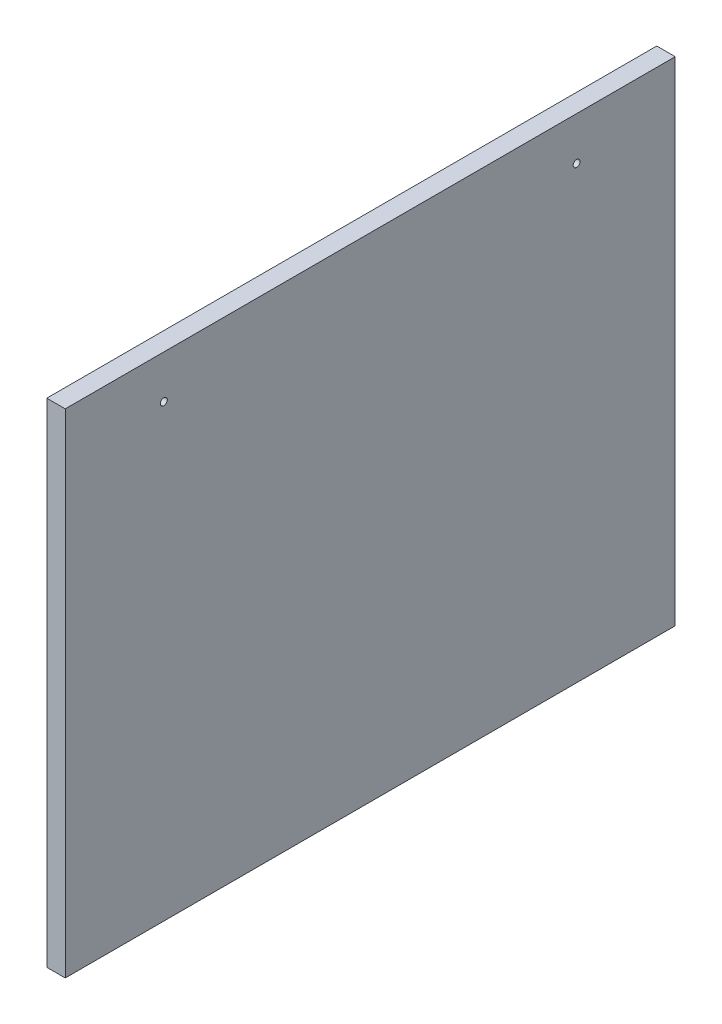
ISO-10303-21;
HEADER;
FILE_DESCRIPTION(('STEP AP214'),'2;1');
FILE_NAME('part.step','',(''),(''),'','','');
FILE_SCHEMA(('AUTOMOTIVE_DESIGN { 1 0 10303 214 1 1 1 1 }'));
ENDSEC;
DATA;
#1=APPLICATION_CONTEXT('core data for automotive mechanical design processes');
#2=APPLICATION_PROTOCOL_DEFINITION('international standard','automotive_design',2000,#1);
#3=PRODUCT_CONTEXT('',#1,'mechanical');
#4=PRODUCT('Part','Part','',(#3));
#5=PRODUCT_RELATED_PRODUCT_CATEGORY('part','',(#4));
#6=PRODUCT_DEFINITION_FORMATION('','',#4);
#7=PRODUCT_DEFINITION_CONTEXT('part definition',#1,'design');
#8=PRODUCT_DEFINITION('design','',#6,#7);
#9=PRODUCT_DEFINITION_SHAPE('','',#8);
#10=(LENGTH_UNIT() NAMED_UNIT(*) SI_UNIT(.MILLI.,.METRE.));
#11=(NAMED_UNIT(*) PLANE_ANGLE_UNIT() SI_UNIT($,.RADIAN.));
#12=(NAMED_UNIT(*) SI_UNIT($,.STERADIAN.) SOLID_ANGLE_UNIT());
#13=UNCERTAINTY_MEASURE_WITH_UNIT(LENGTH_MEASURE(1.E-05),#10,'distance_accuracy_value','');
#14=(GEOMETRIC_REPRESENTATION_CONTEXT(3) GLOBAL_UNCERTAINTY_ASSIGNED_CONTEXT((#13)) GLOBAL_UNIT_ASSIGNED_CONTEXT((#10,
#11,#12)) REPRESENTATION_CONTEXT('',''));
#15=CARTESIAN_POINT('',(0.,0.,0.));
#16=DIRECTION('',(0.,0.,1.));
#17=DIRECTION('',(1.,0.,0.));
#18=AXIS2_PLACEMENT_3D('',#15,#16,#17);
#19=CARTESIAN_POINT('',(19.05,0.,0.));
#20=DIRECTION('',(-1.,0.,0.));
#21=DIRECTION('',(0.,0.,1.));
#22=AXIS2_PLACEMENT_3D('',#19,#20,#21);
#23=PLANE('',#22);
#24=DIRECTION('',(0.,-1.,0.));
#25=VECTOR('',#24,1.);
#26=CARTESIAN_POINT('',(19.05,0.,0.));
#27=LINE('',#26,#25);
#28=CARTESIAN_POINT('',(19.05,508.,0.));
#29=VERTEX_POINT('',#28);
#30=CARTESIAN_POINT('',(19.05,0.,0.));
#31=VERTEX_POINT('',#30);
#32=EDGE_CURVE('E84',#29,#31,#27,.T.);
#33=ORIENTED_EDGE('',*,*,#32,.T.);
#34=DIRECTION('',(0.,0.,-1.));
#35=VECTOR('',#34,1.);
#36=CARTESIAN_POINT('',(19.05,0.,0.));
#37=LINE('',#36,#35);
#38=CARTESIAN_POINT('',(19.05,0.,-628.65));
#39=VERTEX_POINT('',#38);
#40=EDGE_CURVE('E79',#31,#39,#37,.T.);
#41=ORIENTED_EDGE('',*,*,#40,.T.);
#42=DIRECTION('',(0.,1.,0.));
#43=VECTOR('',#42,1.);
#44=CARTESIAN_POINT('',(19.05,0.,-628.65));
#45=LINE('',#44,#43);
#46=CARTESIAN_POINT('',(19.05,508.,-628.65));
#47=VERTEX_POINT('',#46);
#48=EDGE_CURVE('E82',#39,#47,#45,.T.);
#49=ORIENTED_EDGE('',*,*,#48,.T.);
#50=DIRECTION('',(0.,0.,1.));
#51=VECTOR('',#50,1.);
#52=CARTESIAN_POINT('',(19.05,508.,0.));
#53=LINE('',#52,#51);
#54=EDGE_CURVE('E49',#47,#29,#53,.T.);
#55=ORIENTED_EDGE('',*,*,#54,.T.);
#56=EDGE_LOOP('',(#33,#41,#49,#55));
#57=FACE_BOUND('',#56,.T.);
#58=CARTESIAN_POINT('',(19.05,463.55,-101.6));
#59=DIRECTION('',(1.,0.,0.));
#60=DIRECTION('',(0.,0.,-1.));
#61=AXIS2_PLACEMENT_3D('',#58,#59,#60);
#62=CIRCLE('',#61,3.571875);
#63=CARTESIAN_POINT('',(19.05,463.55,-98.0281249999999));
#64=VERTEX_POINT('',#63);
#65=EDGE_CURVE('E99',#64,#64,#62,.T.);
#66=ORIENTED_EDGE('',*,*,#65,.F.);
#67=EDGE_LOOP('',(#66));
#68=FACE_BOUND('',#67,.T.);
#69=CARTESIAN_POINT('',(19.05,463.55,-527.05));
#70=DIRECTION('',(1.,0.,0.));
#71=DIRECTION('',(0.,0.,-1.));
#72=AXIS2_PLACEMENT_3D('',#69,#70,#71);
#73=CIRCLE('',#72,3.57187499999998);
#74=CARTESIAN_POINT('',(19.05,463.55,-523.478125));
#75=VERTEX_POINT('',#74);
#76=EDGE_CURVE('E114',#75,#75,#73,.T.);
#77=ORIENTED_EDGE('',*,*,#76,.F.);
#78=EDGE_LOOP('',(#77));
#79=FACE_BOUND('',#78,.T.);
#80=ADVANCED_FACE('F32',(#57,#68,#79),#23,.F.);
#81=CARTESIAN_POINT('',(0.,0.,0.));
#82=DIRECTION('',(-1.,0.,0.));
#83=DIRECTION('',(0.,0.,1.));
#84=AXIS2_PLACEMENT_3D('',#81,#82,#83);
#85=PLANE('',#84);
#86=CARTESIAN_POINT('',(0.,463.55,-101.6));
#87=DIRECTION('',(1.,0.,0.));
#88=DIRECTION('',(0.,0.,-1.));
#89=AXIS2_PLACEMENT_3D('',#86,#87,#88);
#90=CIRCLE('',#89,3.571875);
#91=CARTESIAN_POINT('',(0.,463.55,-98.0281249999999));
#92=VERTEX_POINT('',#91);
#93=EDGE_CURVE('E111',#92,#92,#90,.T.);
#94=ORIENTED_EDGE('',*,*,#93,.T.);
#95=EDGE_LOOP('',(#94));
#96=FACE_BOUND('',#95,.T.);
#97=DIRECTION('',(0.,-1.,0.));
#98=VECTOR('',#97,1.);
#99=CARTESIAN_POINT('',(0.,0.,0.));
#100=LINE('',#99,#98);
#101=CARTESIAN_POINT('',(0.,508.,0.));
#102=VERTEX_POINT('',#101);
#103=CARTESIAN_POINT('',(0.,0.,0.));
#104=VERTEX_POINT('',#103);
#105=EDGE_CURVE('E96',#102,#104,#100,.T.);
#106=ORIENTED_EDGE('',*,*,#105,.F.);
#107=DIRECTION('',(0.,0.,1.));
#108=VECTOR('',#107,1.);
#109=CARTESIAN_POINT('',(0.,508.,0.));
#110=LINE('',#109,#108);
#111=CARTESIAN_POINT('',(0.,508.,-628.65));
#112=VERTEX_POINT('',#111);
#113=EDGE_CURVE('E72',#112,#102,#110,.T.);
#114=ORIENTED_EDGE('',*,*,#113,.F.);
#115=DIRECTION('',(0.,1.,0.));
#116=VECTOR('',#115,1.);
#117=CARTESIAN_POINT('',(0.,0.,-628.65));
#118=LINE('',#117,#116);
#119=CARTESIAN_POINT('',(0.,0.,-628.65));
#120=VERTEX_POINT('',#119);
#121=EDGE_CURVE('E66',#120,#112,#118,.T.);
#122=ORIENTED_EDGE('',*,*,#121,.F.);
#123=DIRECTION('',(0.,0.,-1.));
#124=VECTOR('',#123,1.);
#125=CARTESIAN_POINT('',(0.,0.,0.));
#126=LINE('',#125,#124);
#127=EDGE_CURVE('E88',#104,#120,#126,.T.);
#128=ORIENTED_EDGE('',*,*,#127,.F.);
#129=EDGE_LOOP('',(#106,#114,#122,#128));
#130=FACE_BOUND('',#129,.T.);
#131=CARTESIAN_POINT('',(0.,463.55,-527.05));
#132=DIRECTION('',(1.,0.,0.));
#133=DIRECTION('',(0.,0.,-1.));
#134=AXIS2_PLACEMENT_3D('',#131,#132,#133);
#135=CIRCLE('',#134,3.57187499999998);
#136=CARTESIAN_POINT('',(0.,463.55,-523.478125));
#137=VERTEX_POINT('',#136);
#138=EDGE_CURVE('E117',#137,#137,#135,.T.);
#139=ORIENTED_EDGE('',*,*,#138,.T.);
#140=EDGE_LOOP('',(#139));
#141=FACE_BOUND('',#140,.T.);
#142=ADVANCED_FACE('F107',(#96,#130,#141),#85,.T.);
#143=CARTESIAN_POINT('',(19.05,0.,0.));
#144=DIRECTION('',(0.,0.,-1.));
#145=DIRECTION('',(-1.,0.,0.));
#146=AXIS2_PLACEMENT_3D('',#143,#144,#145);
#147=PLANE('',#146);
#148=ORIENTED_EDGE('',*,*,#105,.T.);
#149=DIRECTION('',(-1.,0.,0.));
#150=VECTOR('',#149,1.);
#151=CARTESIAN_POINT('',(19.05,0.,0.));
#152=LINE('',#151,#150);
#153=EDGE_CURVE('E11',#31,#104,#152,.T.);
#154=ORIENTED_EDGE('',*,*,#153,.F.);
#155=ORIENTED_EDGE('',*,*,#32,.F.);
#156=DIRECTION('',(-1.,0.,0.));
#157=VECTOR('',#156,1.);
#158=CARTESIAN_POINT('',(19.05,508.,0.));
#159=LINE('',#158,#157);
#160=EDGE_CURVE('E92',#29,#102,#159,.T.);
#161=ORIENTED_EDGE('',*,*,#160,.T.);
#162=EDGE_LOOP('',(#148,#154,#155,#161));
#163=FACE_BOUND('',#162,.T.);
#164=ADVANCED_FACE('F34',(#163),#147,.F.);
#165=CARTESIAN_POINT('',(19.05,0.,0.));
#166=DIRECTION('',(0.,1.,0.));
#167=DIRECTION('',(0.,0.,1.));
#168=AXIS2_PLACEMENT_3D('',#165,#166,#167);
#169=PLANE('',#168);
#170=ORIENTED_EDGE('',*,*,#127,.T.);
#171=DIRECTION('',(-1.,0.,0.));
#172=VECTOR('',#171,1.);
#173=CARTESIAN_POINT('',(19.05,0.,-628.65));
#174=LINE('',#173,#172);
#175=EDGE_CURVE('E41',#39,#120,#174,.T.);
#176=ORIENTED_EDGE('',*,*,#175,.F.);
#177=ORIENTED_EDGE('',*,*,#40,.F.);
#178=ORIENTED_EDGE('',*,*,#153,.T.);
#179=EDGE_LOOP('',(#170,#176,#177,#178));
#180=FACE_BOUND('',#179,.T.);
#181=ADVANCED_FACE('F87',(#180),#169,.F.);
#182=CARTESIAN_POINT('',(19.05,0.,-628.65));
#183=DIRECTION('',(0.,0.,1.));
#184=DIRECTION('',(0.,-1.,0.));
#185=AXIS2_PLACEMENT_3D('',#182,#183,#184);
#186=PLANE('',#185);
#187=ORIENTED_EDGE('',*,*,#121,.T.);
#188=DIRECTION('',(-1.,0.,0.));
#189=VECTOR('',#188,1.);
#190=CARTESIAN_POINT('',(19.05,508.,-628.65));
#191=LINE('',#190,#189);
#192=EDGE_CURVE('E89',#47,#112,#191,.T.);
#193=ORIENTED_EDGE('',*,*,#192,.F.);
#194=ORIENTED_EDGE('',*,*,#48,.F.);
#195=ORIENTED_EDGE('',*,*,#175,.T.);
#196=EDGE_LOOP('',(#187,#193,#194,#195));
#197=FACE_BOUND('',#196,.T.);
#198=ADVANCED_FACE('F90',(#197),#186,.F.);
#199=CARTESIAN_POINT('',(19.05,508.,0.));
#200=DIRECTION('',(0.,-1.,0.));
#201=DIRECTION('',(0.,0.,-1.));
#202=AXIS2_PLACEMENT_3D('',#199,#200,#201);
#203=PLANE('',#202);
#204=ORIENTED_EDGE('',*,*,#113,.T.);
#205=ORIENTED_EDGE('',*,*,#160,.F.);
#206=ORIENTED_EDGE('',*,*,#54,.F.);
#207=ORIENTED_EDGE('',*,*,#192,.T.);
#208=EDGE_LOOP('',(#204,#205,#206,#207));
#209=FACE_BOUND('',#208,.T.);
#210=ADVANCED_FACE('F104',(#209),#203,.F.);
#211=CARTESIAN_POINT('',(19.05,463.55,-101.6));
#212=DIRECTION('',(-1.,0.,0.));
#213=DIRECTION('',(0.,0.,1.));
#214=AXIS2_PLACEMENT_3D('',#211,#212,#213);
#215=CYLINDRICAL_SURFACE('',#214,3.571875);
#216=CARTESIAN_POINT('',(19.05,463.55,-98.0281249999999));
#217=CARTESIAN_POINT('',(18.8515625,463.55,-98.0281249999999));
#218=CARTESIAN_POINT('',(18.653125,463.55,-98.0281249999999));
#219=CARTESIAN_POINT('',(18.25625,463.55,-98.0281249999999));
#220=CARTESIAN_POINT('',(18.0578125,463.55,-98.0281249999999));
#221=CARTESIAN_POINT('',(17.6609375,463.55,-98.0281249999999));
#222=CARTESIAN_POINT('',(17.4625,463.55,-98.0281249999999));
#223=CARTESIAN_POINT('',(17.065625,463.55,-98.0281249999999));
#224=CARTESIAN_POINT('',(16.8671875,463.55,-98.0281249999999));
#225=CARTESIAN_POINT('',(16.4703125,463.55,-98.0281249999999));
#226=CARTESIAN_POINT('',(16.271875,463.55,-98.0281249999999));
#227=CARTESIAN_POINT('',(15.875,463.55,-98.0281249999999));
#228=CARTESIAN_POINT('',(15.6765625,463.55,-98.0281249999999));
#229=CARTESIAN_POINT('',(15.2796875,463.55,-98.0281249999999));
#230=CARTESIAN_POINT('',(15.08125,463.55,-98.0281249999999));
#231=CARTESIAN_POINT('',(14.684375,463.55,-98.0281249999999));
#232=CARTESIAN_POINT('',(14.4859375,463.55,-98.0281249999999));
#233=CARTESIAN_POINT('',(14.0890625,463.55,-98.0281249999999));
#234=CARTESIAN_POINT('',(13.890625,463.55,-98.0281249999999));
#235=CARTESIAN_POINT('',(13.49375,463.55,-98.0281249999999));
#236=CARTESIAN_POINT('',(13.2953125,463.55,-98.0281249999999));
#237=CARTESIAN_POINT('',(12.8984375,463.55,-98.0281249999999));
#238=CARTESIAN_POINT('',(12.7,463.55,-98.0281249999999));
#239=CARTESIAN_POINT('',(12.303125,463.55,-98.0281249999999));
#240=CARTESIAN_POINT('',(12.1046875,463.55,-98.0281249999999));
#241=CARTESIAN_POINT('',(11.7078125,463.55,-98.0281249999999));
#242=CARTESIAN_POINT('',(11.509375,463.55,-98.0281249999999));
#243=CARTESIAN_POINT('',(11.1125,463.55,-98.0281249999999));
#244=CARTESIAN_POINT('',(10.9140625,463.55,-98.0281249999999));
#245=CARTESIAN_POINT('',(10.5171875,463.55,-98.0281249999999));
#246=CARTESIAN_POINT('',(10.31875,463.55,-98.0281249999999));
#247=CARTESIAN_POINT('',(9.921875,463.55,-98.0281249999999));
#248=CARTESIAN_POINT('',(9.7234375,463.55,-98.0281249999999));
#249=CARTESIAN_POINT('',(9.3265625,463.55,-98.0281249999999));
#250=CARTESIAN_POINT('',(9.128125,463.55,-98.0281249999999));
#251=CARTESIAN_POINT('',(8.73125,463.55,-98.0281249999999));
#252=CARTESIAN_POINT('',(8.5328125,463.55,-98.0281249999999));
#253=CARTESIAN_POINT('',(8.1359375,463.55,-98.0281249999999));
#254=CARTESIAN_POINT('',(7.9375,463.55,-98.0281249999999));
#255=CARTESIAN_POINT('',(7.540625,463.55,-98.0281249999999));
#256=CARTESIAN_POINT('',(7.3421875,463.55,-98.0281249999999));
#257=CARTESIAN_POINT('',(6.9453125,463.55,-98.0281249999999));
#258=CARTESIAN_POINT('',(6.746875,463.55,-98.0281249999999));
#259=CARTESIAN_POINT('',(6.35,463.55,-98.0281249999999));
#260=CARTESIAN_POINT('',(6.1515625,463.55,-98.0281249999999));
#261=CARTESIAN_POINT('',(5.7546875,463.55,-98.0281249999999));
#262=CARTESIAN_POINT('',(5.55625,463.55,-98.0281249999999));
#263=CARTESIAN_POINT('',(5.159375,463.55,-98.0281249999999));
#264=CARTESIAN_POINT('',(4.9609375,463.55,-98.0281249999999));
#265=CARTESIAN_POINT('',(4.5640625,463.55,-98.0281249999999));
#266=CARTESIAN_POINT('',(4.365625,463.55,-98.0281249999999));
#267=CARTESIAN_POINT('',(3.96875,463.55,-98.0281249999999));
#268=CARTESIAN_POINT('',(3.7703125,463.55,-98.0281249999999));
#269=CARTESIAN_POINT('',(3.3734375,463.55,-98.0281249999999));
#270=CARTESIAN_POINT('',(3.175,463.55,-98.0281249999999));
#271=CARTESIAN_POINT('',(2.778125,463.55,-98.0281249999999));
#272=CARTESIAN_POINT('',(2.5796875,463.55,-98.0281249999999));
#273=CARTESIAN_POINT('',(2.1828125,463.55,-98.0281249999999));
#274=CARTESIAN_POINT('',(1.984375,463.55,-98.0281249999999));
#275=CARTESIAN_POINT('',(1.5875,463.55,-98.0281249999999));
#276=CARTESIAN_POINT('',(1.3890625,463.55,-98.0281249999999));
#277=CARTESIAN_POINT('',(0.992187500000001,463.55,-98.0281249999999));
#278=CARTESIAN_POINT('',(0.793750000000001,463.55,-98.0281249999999));
#279=CARTESIAN_POINT('',(0.396875,463.55,-98.0281249999999));
#280=CARTESIAN_POINT('',(0.1984375,463.55,-98.0281249999999));
#281=CARTESIAN_POINT('',(0.,463.55,-98.0281249999999));
#282=B_SPLINE_CURVE_WITH_KNOTS('',3,(#216,#217,#218,#219,#220,#221,#222,#223,#224,#225,#226,
#227,#228,#229,#230,#231,#232,#233,#234,#235,#236,#237,#238,#239,#240,#241,#242,#243,#244,#245,
#246,#247,#248,#249,#250,#251,#252,#253,#254,#255,#256,#257,#258,#259,#260,#261,#262,#263,#264,
#265,#266,#267,#268,#269,#270,#271,#272,#273,#274,#275,#276,#277,#278,#279,#280,#281),
.UNSPECIFIED.,.F.,.F.,(4,2,2,2,2,2,2,2,2,2,2,2,2,2,2,2,2,2,2,2,2,2,2,2,2,2,2,2,2,2,2,2,4),(0.,
0.5953125,1.190625,1.7859375,2.38125,2.9765625,3.571875,4.1671875,4.7625,5.3578125,5.953125,
6.5484375,7.14375,7.7390625,8.334375,8.9296875,9.525,10.1203125,10.715625,11.3109375,11.90625,
12.5015625,13.096875,13.6921875,14.2875,14.8828125,15.478125,16.0734375,16.66875,17.2640625,
17.859375,18.4546875,19.05),.UNSPECIFIED.);
#283=EDGE_CURVE('BSEAM134',#64,#92,#282,.T.);
#284=ORIENTED_EDGE('',*,*,#65,.T.);
#285=ORIENTED_EDGE('',*,*,#93,.F.);
#286=ORIENTED_EDGE('',*,*,#283,.T.);
#287=ORIENTED_EDGE('',*,*,#283,.F.);
#288=EDGE_LOOP('',(#284,#286,#285,#287));
#289=FACE_BOUND('',#288,.T.);
#290=ADVANCED_FACE('F134',(#289),#215,.F.);
#291=CARTESIAN_POINT('',(19.05,463.55,-527.05));
#292=DIRECTION('',(-1.,0.,0.));
#293=DIRECTION('',(0.,0.,1.));
#294=AXIS2_PLACEMENT_3D('',#291,#292,#293);
#295=CYLINDRICAL_SURFACE('',#294,3.57187499999998);
#296=CARTESIAN_POINT('',(19.05,463.55,-523.478125));
#297=CARTESIAN_POINT('',(18.8515625,463.55,-523.478125));
#298=CARTESIAN_POINT('',(18.653125,463.55,-523.478125));
#299=CARTESIAN_POINT('',(18.25625,463.55,-523.478125));
#300=CARTESIAN_POINT('',(18.0578125,463.55,-523.478125));
#301=CARTESIAN_POINT('',(17.6609375,463.55,-523.478125));
#302=CARTESIAN_POINT('',(17.4625,463.55,-523.478125));
#303=CARTESIAN_POINT('',(17.065625,463.55,-523.478125));
#304=CARTESIAN_POINT('',(16.8671875,463.55,-523.478125));
#305=CARTESIAN_POINT('',(16.4703125,463.55,-523.478125));
#306=CARTESIAN_POINT('',(16.271875,463.55,-523.478125));
#307=CARTESIAN_POINT('',(15.875,463.55,-523.478125));
#308=CARTESIAN_POINT('',(15.6765625,463.55,-523.478125));
#309=CARTESIAN_POINT('',(15.2796875,463.55,-523.478125));
#310=CARTESIAN_POINT('',(15.08125,463.55,-523.478125));
#311=CARTESIAN_POINT('',(14.684375,463.55,-523.478125));
#312=CARTESIAN_POINT('',(14.4859375,463.55,-523.478125));
#313=CARTESIAN_POINT('',(14.0890625,463.55,-523.478125));
#314=CARTESIAN_POINT('',(13.890625,463.55,-523.478125));
#315=CARTESIAN_POINT('',(13.49375,463.55,-523.478125));
#316=CARTESIAN_POINT('',(13.2953125,463.55,-523.478125));
#317=CARTESIAN_POINT('',(12.8984375,463.55,-523.478125));
#318=CARTESIAN_POINT('',(12.7,463.55,-523.478125));
#319=CARTESIAN_POINT('',(12.303125,463.55,-523.478125));
#320=CARTESIAN_POINT('',(12.1046875,463.55,-523.478125));
#321=CARTESIAN_POINT('',(11.7078125,463.55,-523.478125));
#322=CARTESIAN_POINT('',(11.509375,463.55,-523.478125));
#323=CARTESIAN_POINT('',(11.1125,463.55,-523.478125));
#324=CARTESIAN_POINT('',(10.9140625,463.55,-523.478125));
#325=CARTESIAN_POINT('',(10.5171875,463.55,-523.478125));
#326=CARTESIAN_POINT('',(10.31875,463.55,-523.478125));
#327=CARTESIAN_POINT('',(9.921875,463.55,-523.478125));
#328=CARTESIAN_POINT('',(9.7234375,463.55,-523.478125));
#329=CARTESIAN_POINT('',(9.3265625,463.55,-523.478125));
#330=CARTESIAN_POINT('',(9.128125,463.55,-523.478125));
#331=CARTESIAN_POINT('',(8.73125,463.55,-523.478125));
#332=CARTESIAN_POINT('',(8.5328125,463.55,-523.478125));
#333=CARTESIAN_POINT('',(8.1359375,463.55,-523.478125));
#334=CARTESIAN_POINT('',(7.9375,463.55,-523.478125));
#335=CARTESIAN_POINT('',(7.540625,463.55,-523.478125));
#336=CARTESIAN_POINT('',(7.3421875,463.55,-523.478125));
#337=CARTESIAN_POINT('',(6.9453125,463.55,-523.478125));
#338=CARTESIAN_POINT('',(6.746875,463.55,-523.478125));
#339=CARTESIAN_POINT('',(6.35,463.55,-523.478125));
#340=CARTESIAN_POINT('',(6.1515625,463.55,-523.478125));
#341=CARTESIAN_POINT('',(5.7546875,463.55,-523.478125));
#342=CARTESIAN_POINT('',(5.55625,463.55,-523.478125));
#343=CARTESIAN_POINT('',(5.159375,463.55,-523.478125));
#344=CARTESIAN_POINT('',(4.9609375,463.55,-523.478125));
#345=CARTESIAN_POINT('',(4.5640625,463.55,-523.478125));
#346=CARTESIAN_POINT('',(4.365625,463.55,-523.478125));
#347=CARTESIAN_POINT('',(3.96875,463.55,-523.478125));
#348=CARTESIAN_POINT('',(3.7703125,463.55,-523.478125));
#349=CARTESIAN_POINT('',(3.3734375,463.55,-523.478125));
#350=CARTESIAN_POINT('',(3.175,463.55,-523.478125));
#351=CARTESIAN_POINT('',(2.778125,463.55,-523.478125));
#352=CARTESIAN_POINT('',(2.5796875,463.55,-523.478125));
#353=CARTESIAN_POINT('',(2.1828125,463.55,-523.478125));
#354=CARTESIAN_POINT('',(1.984375,463.55,-523.478125));
#355=CARTESIAN_POINT('',(1.5875,463.55,-523.478125));
#356=CARTESIAN_POINT('',(1.3890625,463.55,-523.478125));
#357=CARTESIAN_POINT('',(0.992187500000001,463.55,-523.478125));
#358=CARTESIAN_POINT('',(0.793750000000001,463.55,-523.478125));
#359=CARTESIAN_POINT('',(0.396875,463.55,-523.478125));
#360=CARTESIAN_POINT('',(0.1984375,463.55,-523.478125));
#361=CARTESIAN_POINT('',(0.,463.55,-523.478125));
#362=B_SPLINE_CURVE_WITH_KNOTS('',3,(#296,#297,#298,#299,#300,#301,#302,#303,#304,#305,#306,
#307,#308,#309,#310,#311,#312,#313,#314,#315,#316,#317,#318,#319,#320,#321,#322,#323,#324,#325,
#326,#327,#328,#329,#330,#331,#332,#333,#334,#335,#336,#337,#338,#339,#340,#341,#342,#343,#344,
#345,#346,#347,#348,#349,#350,#351,#352,#353,#354,#355,#356,#357,#358,#359,#360,#361),
.UNSPECIFIED.,.F.,.F.,(4,2,2,2,2,2,2,2,2,2,2,2,2,2,2,2,2,2,2,2,2,2,2,2,2,2,2,2,2,2,2,2,4),(0.,
0.5953125,1.190625,1.7859375,2.38125,2.9765625,3.571875,4.1671875,4.7625,5.3578125,5.953125,
6.5484375,7.14375,7.7390625,8.334375,8.9296875,9.525,10.1203125,10.715625,11.3109375,11.90625,
12.5015625,13.096875,13.6921875,14.2875,14.8828125,15.478125,16.0734375,16.66875,17.2640625,
17.859375,18.4546875,19.05),.UNSPECIFIED.);
#363=EDGE_CURVE('BSEAM123',#75,#137,#362,.T.);
#364=ORIENTED_EDGE('',*,*,#76,.T.);
#365=ORIENTED_EDGE('',*,*,#138,.F.);
#366=ORIENTED_EDGE('',*,*,#363,.T.);
#367=ORIENTED_EDGE('',*,*,#363,.F.);
#368=EDGE_LOOP('',(#364,#366,#365,#367));
#369=FACE_BOUND('',#368,.T.);
#370=ADVANCED_FACE('F123',(#369),#295,.F.);
#371=CLOSED_SHELL('',(#80,#142,#164,#181,#198,#210,#290,#370));
#372=MANIFOLD_SOLID_BREP('B2',#371);
#373=ADVANCED_BREP_SHAPE_REPRESENTATION('',(#18,#372),#14);
#374=SHAPE_DEFINITION_REPRESENTATION(#9,#373);
ENDSEC;
END-ISO-10303-21;
